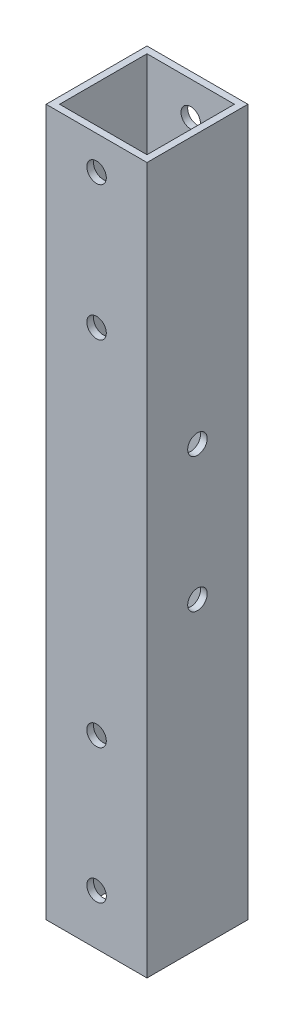
ISO-10303-21;
HEADER;
FILE_DESCRIPTION(('STEP AP214'),'2;1');
FILE_NAME('part.step','',(''),(''),'','','');
FILE_SCHEMA(('AUTOMOTIVE_DESIGN { 1 0 10303 214 1 1 1 1 }'));
ENDSEC;
DATA;
#1=APPLICATION_CONTEXT('core data for automotive mechanical design processes');
#2=APPLICATION_PROTOCOL_DEFINITION('international standard','automotive_design',2000,#1);
#3=PRODUCT_CONTEXT('',#1,'mechanical');
#4=PRODUCT('Part','Part','',(#3));
#5=PRODUCT_RELATED_PRODUCT_CATEGORY('part','',(#4));
#6=PRODUCT_DEFINITION_FORMATION('','',#4);
#7=PRODUCT_DEFINITION_CONTEXT('part definition',#1,'design');
#8=PRODUCT_DEFINITION('design','',#6,#7);
#9=PRODUCT_DEFINITION_SHAPE('','',#8);
#10=(LENGTH_UNIT() NAMED_UNIT(*) SI_UNIT(.MILLI.,.METRE.));
#11=(NAMED_UNIT(*) PLANE_ANGLE_UNIT() SI_UNIT($,.RADIAN.));
#12=(NAMED_UNIT(*) SI_UNIT($,.STERADIAN.) SOLID_ANGLE_UNIT());
#13=UNCERTAINTY_MEASURE_WITH_UNIT(LENGTH_MEASURE(1.E-05),#10,'distance_accuracy_value','');
#14=(GEOMETRIC_REPRESENTATION_CONTEXT(3) GLOBAL_UNCERTAINTY_ASSIGNED_CONTEXT((#13)) GLOBAL_UNIT_ASSIGNED_CONTEXT((#10,
#11,#12)) REPRESENTATION_CONTEXT('',''));
#15=CARTESIAN_POINT('',(0.,0.,0.));
#16=DIRECTION('',(0.,0.,1.));
#17=DIRECTION('',(1.,0.,0.));
#18=AXIS2_PLACEMENT_3D('',#15,#16,#17);
#19=CARTESIAN_POINT('',(0.,105.,0.));
#20=DIRECTION('',(0.,1.,0.));
#21=DIRECTION('',(0.,0.,1.));
#22=AXIS2_PLACEMENT_3D('',#19,#20,#21);
#23=PLANE('',#22);
#24=DIRECTION('',(0.,0.,-1.));
#25=VECTOR('',#24,1.);
#26=CARTESIAN_POINT('',(7.5,105.,7.5));
#27=LINE('',#26,#25);
#28=CARTESIAN_POINT('',(7.5,105.,7.5));
#29=VERTEX_POINT('',#28);
#30=CARTESIAN_POINT('',(7.5,105.,-7.5));
#31=VERTEX_POINT('',#30);
#32=EDGE_CURVE('E187',#29,#31,#27,.T.);
#33=ORIENTED_EDGE('',*,*,#32,.T.);
#34=DIRECTION('',(-1.,0.,0.));
#35=VECTOR('',#34,1.);
#36=CARTESIAN_POINT('',(-7.5,105.,-7.5));
#37=LINE('',#36,#35);
#38=CARTESIAN_POINT('',(-7.5,105.,-7.5));
#39=VERTEX_POINT('',#38);
#40=EDGE_CURVE('E191',#31,#39,#37,.T.);
#41=ORIENTED_EDGE('',*,*,#40,.T.);
#42=DIRECTION('',(0.,0.,1.));
#43=VECTOR('',#42,1.);
#44=CARTESIAN_POINT('',(-7.5,105.,7.5));
#45=LINE('',#44,#43);
#46=CARTESIAN_POINT('',(-7.5,105.,7.5));
#47=VERTEX_POINT('',#46);
#48=EDGE_CURVE('E195',#39,#47,#45,.T.);
#49=ORIENTED_EDGE('',*,*,#48,.T.);
#50=DIRECTION('',(1.,0.,0.));
#51=VECTOR('',#50,1.);
#52=CARTESIAN_POINT('',(-7.5,105.,7.5));
#53=LINE('',#52,#51);
#54=EDGE_CURVE('E198',#47,#29,#53,.T.);
#55=ORIENTED_EDGE('',*,*,#54,.T.);
#56=EDGE_LOOP('',(#33,#41,#49,#55));
#57=FACE_BOUND('',#56,.T.);
#58=DIRECTION('',(-1.,0.,0.));
#59=VECTOR('',#58,1.);
#60=CARTESIAN_POINT('',(0.,105.,-6.5));
#61=LINE('',#60,#59);
#62=CARTESIAN_POINT('',(6.5,105.,-6.5));
#63=VERTEX_POINT('',#62);
#64=CARTESIAN_POINT('',(-6.5,105.,-6.5));
#65=VERTEX_POINT('',#64);
#66=EDGE_CURVE('E146',#63,#65,#61,.T.);
#67=ORIENTED_EDGE('',*,*,#66,.F.);
#68=DIRECTION('',(0.,0.,-1.));
#69=VECTOR('',#68,1.);
#70=CARTESIAN_POINT('',(6.5,105.,0.));
#71=LINE('',#70,#69);
#72=CARTESIAN_POINT('',(6.5,105.,6.5));
#73=VERTEX_POINT('',#72);
#74=EDGE_CURVE('E137',#73,#63,#71,.T.);
#75=ORIENTED_EDGE('',*,*,#74,.F.);
#76=DIRECTION('',(1.,0.,0.));
#77=VECTOR('',#76,1.);
#78=CARTESIAN_POINT('',(0.,105.,6.5));
#79=LINE('',#78,#77);
#80=CARTESIAN_POINT('',(-6.5,105.,6.5));
#81=VERTEX_POINT('',#80);
#82=EDGE_CURVE('E163',#81,#73,#79,.T.);
#83=ORIENTED_EDGE('',*,*,#82,.F.);
#84=DIRECTION('',(0.,0.,1.));
#85=VECTOR('',#84,1.);
#86=CARTESIAN_POINT('',(-6.5,105.,0.));
#87=LINE('',#86,#85);
#88=EDGE_CURVE('E159',#65,#81,#87,.T.);
#89=ORIENTED_EDGE('',*,*,#88,.F.);
#90=EDGE_LOOP('',(#67,#75,#83,#89));
#91=FACE_BOUND('',#90,.T.);
#92=ADVANCED_FACE('F69',(#57,#91),#23,.T.);
#93=CARTESIAN_POINT('',(0.,0.,0.));
#94=DIRECTION('',(0.,1.,0.));
#95=DIRECTION('',(0.,0.,1.));
#96=AXIS2_PLACEMENT_3D('',#93,#94,#95);
#97=PLANE('',#96);
#98=DIRECTION('',(0.,0.,-1.));
#99=VECTOR('',#98,1.);
#100=CARTESIAN_POINT('',(7.5,0.,7.5));
#101=LINE('',#100,#99);
#102=CARTESIAN_POINT('',(7.5,0.,7.5));
#103=VERTEX_POINT('',#102);
#104=CARTESIAN_POINT('',(7.5,0.,-7.5));
#105=VERTEX_POINT('',#104);
#106=EDGE_CURVE('E155',#103,#105,#101,.T.);
#107=ORIENTED_EDGE('',*,*,#106,.F.);
#108=DIRECTION('',(1.,0.,0.));
#109=VECTOR('',#108,1.);
#110=CARTESIAN_POINT('',(-7.5,0.,7.5));
#111=LINE('',#110,#109);
#112=CARTESIAN_POINT('',(-7.5,0.,7.5));
#113=VERTEX_POINT('',#112);
#114=EDGE_CURVE('E192',#113,#103,#111,.T.);
#115=ORIENTED_EDGE('',*,*,#114,.F.);
#116=DIRECTION('',(0.,0.,1.));
#117=VECTOR('',#116,1.);
#118=CARTESIAN_POINT('',(-7.5,0.,7.5));
#119=LINE('',#118,#117);
#120=CARTESIAN_POINT('',(-7.5,0.,-7.5));
#121=VERTEX_POINT('',#120);
#122=EDGE_CURVE('E208',#121,#113,#119,.T.);
#123=ORIENTED_EDGE('',*,*,#122,.F.);
#124=DIRECTION('',(-1.,0.,0.));
#125=VECTOR('',#124,1.);
#126=CARTESIAN_POINT('',(-7.5,0.,-7.5));
#127=LINE('',#126,#125);
#128=EDGE_CURVE('E205',#105,#121,#127,.T.);
#129=ORIENTED_EDGE('',*,*,#128,.F.);
#130=EDGE_LOOP('',(#107,#115,#123,#129));
#131=FACE_BOUND('',#130,.T.);
#132=DIRECTION('',(0.,0.,-1.));
#133=VECTOR('',#132,1.);
#134=CARTESIAN_POINT('',(6.5,0.,0.));
#135=LINE('',#134,#133);
#136=CARTESIAN_POINT('',(6.5,0.,6.5));
#137=VERTEX_POINT('',#136);
#138=CARTESIAN_POINT('',(6.5,0.,-6.5));
#139=VERTEX_POINT('',#138);
#140=EDGE_CURVE('E95',#137,#139,#135,.T.);
#141=ORIENTED_EDGE('',*,*,#140,.T.);
#142=DIRECTION('',(-1.,0.,0.));
#143=VECTOR('',#142,1.);
#144=CARTESIAN_POINT('',(0.,0.,-6.5));
#145=LINE('',#144,#143);
#146=CARTESIAN_POINT('',(-6.5,0.,-6.5));
#147=VERTEX_POINT('',#146);
#148=EDGE_CURVE('E153',#139,#147,#145,.T.);
#149=ORIENTED_EDGE('',*,*,#148,.T.);
#150=DIRECTION('',(0.,0.,1.));
#151=VECTOR('',#150,1.);
#152=CARTESIAN_POINT('',(-6.5,0.,0.));
#153=LINE('',#152,#151);
#154=CARTESIAN_POINT('',(-6.5,0.,6.5));
#155=VERTEX_POINT('',#154);
#156=EDGE_CURVE('E174',#147,#155,#153,.T.);
#157=ORIENTED_EDGE('',*,*,#156,.T.);
#158=DIRECTION('',(1.,0.,0.));
#159=VECTOR('',#158,1.);
#160=CARTESIAN_POINT('',(0.,0.,6.5));
#161=LINE('',#160,#159);
#162=EDGE_CURVE('E147',#155,#137,#161,.T.);
#163=ORIENTED_EDGE('',*,*,#162,.T.);
#164=EDGE_LOOP('',(#141,#149,#157,#163));
#165=FACE_BOUND('',#164,.T.);
#166=ADVANCED_FACE('F353',(#131,#165),#97,.F.);
#167=CARTESIAN_POINT('',(7.5,105.,7.5));
#168=DIRECTION('',(-1.,0.,0.));
#169=DIRECTION('',(0.,0.,1.));
#170=AXIS2_PLACEMENT_3D('',#167,#168,#169);
#171=PLANE('',#170);
#172=CARTESIAN_POINT('',(7.5,65.,0.));
#173=DIRECTION('',(1.,0.,0.));
#174=DIRECTION('',(0.,0.,-1.));
#175=AXIS2_PLACEMENT_3D('',#172,#173,#174);
#176=CIRCLE('',#175,1.45);
#177=CARTESIAN_POINT('',(7.5,65.,-1.45));
#178=VERTEX_POINT('',#177);
#179=EDGE_CURVE('E254',#178,#178,#176,.T.);
#180=ORIENTED_EDGE('',*,*,#179,.F.);
#181=EDGE_LOOP('',(#180));
#182=FACE_BOUND('',#181,.T.);
#183=CARTESIAN_POINT('',(7.5,45.,0.));
#184=DIRECTION('',(1.,0.,0.));
#185=DIRECTION('',(0.,0.,-1.));
#186=AXIS2_PLACEMENT_3D('',#183,#184,#185);
#187=CIRCLE('',#186,1.45);
#188=CARTESIAN_POINT('',(7.5,45.,-1.45));
#189=VERTEX_POINT('',#188);
#190=EDGE_CURVE('E260',#189,#189,#187,.T.);
#191=ORIENTED_EDGE('',*,*,#190,.F.);
#192=EDGE_LOOP('',(#191));
#193=FACE_BOUND('',#192,.T.);
#194=ORIENTED_EDGE('',*,*,#106,.T.);
#195=DIRECTION('',(0.,-1.,0.));
#196=VECTOR('',#195,1.);
#197=CARTESIAN_POINT('',(7.5,105.,-7.5));
#198=LINE('',#197,#196);
#199=EDGE_CURVE('E12',#31,#105,#198,.T.);
#200=ORIENTED_EDGE('',*,*,#199,.F.);
#201=ORIENTED_EDGE('',*,*,#32,.F.);
#202=DIRECTION('',(0.,-1.,0.));
#203=VECTOR('',#202,1.);
#204=CARTESIAN_POINT('',(7.5,105.,7.5));
#205=LINE('',#204,#203);
#206=EDGE_CURVE('E201',#29,#103,#205,.T.);
#207=ORIENTED_EDGE('',*,*,#206,.T.);
#208=EDGE_LOOP('',(#194,#200,#201,#207));
#209=FACE_BOUND('',#208,.T.);
#210=ADVANCED_FACE('F71',(#182,#193,#209),#171,.F.);
#211=CARTESIAN_POINT('',(-7.5,105.,-7.5));
#212=DIRECTION('',(0.,0.,1.));
#213=DIRECTION('',(1.,0.,0.));
#214=AXIS2_PLACEMENT_3D('',#211,#212,#213);
#215=PLANE('',#214);
#216=CARTESIAN_POINT('',(0.,7.5,-7.5));
#217=DIRECTION('',(0.,0.,1.));
#218=DIRECTION('',(1.,0.,0.));
#219=AXIS2_PLACEMENT_3D('',#216,#217,#218);
#220=CIRCLE('',#219,1.45);
#221=CARTESIAN_POINT('',(1.45,7.5,-7.5));
#222=VERTEX_POINT('',#221);
#223=EDGE_CURVE('E228',#222,#222,#220,.T.);
#224=ORIENTED_EDGE('',*,*,#223,.T.);
#225=EDGE_LOOP('',(#224));
#226=FACE_BOUND('',#225,.T.);
#227=CARTESIAN_POINT('',(0.,80.,-7.5));
#228=DIRECTION('',(0.,0.,1.));
#229=DIRECTION('',(1.,0.,0.));
#230=AXIS2_PLACEMENT_3D('',#227,#228,#229);
#231=CIRCLE('',#230,1.45);
#232=CARTESIAN_POINT('',(1.45,80.,-7.5));
#233=VERTEX_POINT('',#232);
#234=EDGE_CURVE('E274',#233,#233,#231,.T.);
#235=ORIENTED_EDGE('',*,*,#234,.T.);
#236=EDGE_LOOP('',(#235));
#237=FACE_BOUND('',#236,.T.);
#238=CARTESIAN_POINT('',(0.,100.,-7.5));
#239=DIRECTION('',(0.,0.,1.));
#240=DIRECTION('',(1.,0.,0.));
#241=AXIS2_PLACEMENT_3D('',#238,#239,#240);
#242=CIRCLE('',#241,1.45);
#243=CARTESIAN_POINT('',(1.45,100.,-7.5));
#244=VERTEX_POINT('',#243);
#245=EDGE_CURVE('E287',#244,#244,#242,.T.);
#246=ORIENTED_EDGE('',*,*,#245,.T.);
#247=EDGE_LOOP('',(#246));
#248=FACE_BOUND('',#247,.T.);
#249=CARTESIAN_POINT('',(0.,27.5,-7.5));
#250=DIRECTION('',(0.,0.,1.));
#251=DIRECTION('',(1.,0.,0.));
#252=AXIS2_PLACEMENT_3D('',#249,#250,#251);
#253=CIRCLE('',#252,1.45);
#254=CARTESIAN_POINT('',(1.45,27.5,-7.5));
#255=VERTEX_POINT('',#254);
#256=EDGE_CURVE('E294',#255,#255,#253,.T.);
#257=ORIENTED_EDGE('',*,*,#256,.T.);
#258=EDGE_LOOP('',(#257));
#259=FACE_BOUND('',#258,.T.);
#260=ORIENTED_EDGE('',*,*,#128,.T.);
#261=DIRECTION('',(0.,-1.,0.));
#262=VECTOR('',#261,1.);
#263=CARTESIAN_POINT('',(-7.5,105.,-7.5));
#264=LINE('',#263,#262);
#265=EDGE_CURVE('E79',#39,#121,#264,.T.);
#266=ORIENTED_EDGE('',*,*,#265,.F.);
#267=ORIENTED_EDGE('',*,*,#40,.F.);
#268=ORIENTED_EDGE('',*,*,#199,.T.);
#269=EDGE_LOOP('',(#260,#266,#267,#268));
#270=FACE_BOUND('',#269,.T.);
#271=ADVANCED_FACE('F339',(#226,#237,#248,#259,#270),#215,.F.);
#272=CARTESIAN_POINT('',(-7.5,105.,7.5));
#273=DIRECTION('',(1.,0.,0.));
#274=DIRECTION('',(0.,0.,-1.));
#275=AXIS2_PLACEMENT_3D('',#272,#273,#274);
#276=PLANE('',#275);
#277=CARTESIAN_POINT('',(-7.5,65.,0.));
#278=DIRECTION('',(1.,0.,0.));
#279=DIRECTION('',(0.,0.,-1.));
#280=AXIS2_PLACEMENT_3D('',#277,#278,#279);
#281=CIRCLE('',#280,1.45);
#282=CARTESIAN_POINT('',(-7.5,65.,-1.45));
#283=VERTEX_POINT('',#282);
#284=EDGE_CURVE('E246',#283,#283,#281,.T.);
#285=ORIENTED_EDGE('',*,*,#284,.T.);
#286=EDGE_LOOP('',(#285));
#287=FACE_BOUND('',#286,.T.);
#288=CARTESIAN_POINT('',(-7.5,45.,0.));
#289=DIRECTION('',(1.,0.,0.));
#290=DIRECTION('',(0.,0.,-1.));
#291=AXIS2_PLACEMENT_3D('',#288,#289,#290);
#292=CIRCLE('',#291,1.45);
#293=CARTESIAN_POINT('',(-7.5,45.,-1.45));
#294=VERTEX_POINT('',#293);
#295=EDGE_CURVE('E266',#294,#294,#292,.T.);
#296=ORIENTED_EDGE('',*,*,#295,.T.);
#297=EDGE_LOOP('',(#296));
#298=FACE_BOUND('',#297,.T.);
#299=ORIENTED_EDGE('',*,*,#122,.T.);
#300=DIRECTION('',(0.,-1.,0.));
#301=VECTOR('',#300,1.);
#302=CARTESIAN_POINT('',(-7.5,105.,7.5));
#303=LINE('',#302,#301);
#304=EDGE_CURVE('E216',#47,#113,#303,.T.);
#305=ORIENTED_EDGE('',*,*,#304,.F.);
#306=ORIENTED_EDGE('',*,*,#48,.F.);
#307=ORIENTED_EDGE('',*,*,#265,.T.);
#308=EDGE_LOOP('',(#299,#305,#306,#307));
#309=FACE_BOUND('',#308,.T.);
#310=ADVANCED_FACE('F342',(#287,#298,#309),#276,.F.);
#311=CARTESIAN_POINT('',(-7.5,105.,7.5));
#312=DIRECTION('',(0.,0.,-1.));
#313=DIRECTION('',(-1.,0.,0.));
#314=AXIS2_PLACEMENT_3D('',#311,#312,#313);
#315=PLANE('',#314);
#316=CARTESIAN_POINT('',(0.,7.5,7.5));
#317=DIRECTION('',(0.,0.,1.));
#318=DIRECTION('',(1.,0.,0.));
#319=AXIS2_PLACEMENT_3D('',#316,#317,#318);
#320=CIRCLE('',#319,1.45);
#321=CARTESIAN_POINT('',(1.45,7.5,7.5));
#322=VERTEX_POINT('',#321);
#323=EDGE_CURVE('E278',#322,#322,#320,.T.);
#324=ORIENTED_EDGE('',*,*,#323,.F.);
#325=EDGE_LOOP('',(#324));
#326=FACE_BOUND('',#325,.T.);
#327=CARTESIAN_POINT('',(0.,80.,7.5));
#328=DIRECTION('',(0.,0.,1.));
#329=DIRECTION('',(1.,0.,0.));
#330=AXIS2_PLACEMENT_3D('',#327,#328,#329);
#331=CIRCLE('',#330,1.45);
#332=CARTESIAN_POINT('',(1.45,80.,7.5));
#333=VERTEX_POINT('',#332);
#334=EDGE_CURVE('E283',#333,#333,#331,.T.);
#335=ORIENTED_EDGE('',*,*,#334,.F.);
#336=EDGE_LOOP('',(#335));
#337=FACE_BOUND('',#336,.T.);
#338=CARTESIAN_POINT('',(0.,100.,7.5));
#339=DIRECTION('',(0.,0.,1.));
#340=DIRECTION('',(1.,0.,0.));
#341=AXIS2_PLACEMENT_3D('',#338,#339,#340);
#342=CIRCLE('',#341,1.45);
#343=CARTESIAN_POINT('',(1.45,100.,7.5));
#344=VERTEX_POINT('',#343);
#345=EDGE_CURVE('E298',#344,#344,#342,.T.);
#346=ORIENTED_EDGE('',*,*,#345,.F.);
#347=EDGE_LOOP('',(#346));
#348=FACE_BOUND('',#347,.T.);
#349=CARTESIAN_POINT('',(0.,27.5,7.5));
#350=DIRECTION('',(0.,0.,1.));
#351=DIRECTION('',(1.,0.,0.));
#352=AXIS2_PLACEMENT_3D('',#349,#350,#351);
#353=CIRCLE('',#352,1.45);
#354=CARTESIAN_POINT('',(1.45,27.5,7.5));
#355=VERTEX_POINT('',#354);
#356=EDGE_CURVE('E282',#355,#355,#353,.T.);
#357=ORIENTED_EDGE('',*,*,#356,.F.);
#358=EDGE_LOOP('',(#357));
#359=FACE_BOUND('',#358,.T.);
#360=ORIENTED_EDGE('',*,*,#114,.T.);
#361=ORIENTED_EDGE('',*,*,#206,.F.);
#362=ORIENTED_EDGE('',*,*,#54,.F.);
#363=ORIENTED_EDGE('',*,*,#304,.T.);
#364=EDGE_LOOP('',(#360,#361,#362,#363));
#365=FACE_BOUND('',#364,.T.);
#366=ADVANCED_FACE('F357',(#326,#337,#348,#359,#365),#315,.F.);
#367=CARTESIAN_POINT('',(6.5,105.,0.));
#368=DIRECTION('',(-1.,0.,0.));
#369=DIRECTION('',(0.,0.,1.));
#370=AXIS2_PLACEMENT_3D('',#367,#368,#369);
#371=PLANE('',#370);
#372=CARTESIAN_POINT('',(6.5,65.,0.));
#373=DIRECTION('',(-1.,0.,0.));
#374=DIRECTION('',(0.,0.,1.));
#375=AXIS2_PLACEMENT_3D('',#372,#373,#374);
#376=CIRCLE('',#375,1.45);
#377=CARTESIAN_POINT('',(6.5,65.,1.45));
#378=VERTEX_POINT('',#377);
#379=EDGE_CURVE('E270',#378,#378,#376,.T.);
#380=ORIENTED_EDGE('',*,*,#379,.F.);
#381=EDGE_LOOP('',(#380));
#382=FACE_BOUND('',#381,.T.);
#383=CARTESIAN_POINT('',(6.5,45.,0.));
#384=DIRECTION('',(-1.,0.,0.));
#385=DIRECTION('',(0.,0.,1.));
#386=AXIS2_PLACEMENT_3D('',#383,#384,#385);
#387=CIRCLE('',#386,1.45);
#388=CARTESIAN_POINT('',(6.5,45.,1.45));
#389=VERTEX_POINT('',#388);
#390=EDGE_CURVE('E245',#389,#389,#387,.T.);
#391=ORIENTED_EDGE('',*,*,#390,.F.);
#392=EDGE_LOOP('',(#391));
#393=FACE_BOUND('',#392,.T.);
#394=ORIENTED_EDGE('',*,*,#140,.F.);
#395=DIRECTION('',(0.,-1.,0.));
#396=VECTOR('',#395,1.);
#397=CARTESIAN_POINT('',(6.5,105.,6.5));
#398=LINE('',#397,#396);
#399=EDGE_CURVE('E141',#73,#137,#398,.T.);
#400=ORIENTED_EDGE('',*,*,#399,.F.);
#401=ORIENTED_EDGE('',*,*,#74,.T.);
#402=DIRECTION('',(0.,-1.,0.));
#403=VECTOR('',#402,1.);
#404=CARTESIAN_POINT('',(6.5,105.,-6.5));
#405=LINE('',#404,#403);
#406=EDGE_CURVE('E140',#63,#139,#405,.T.);
#407=ORIENTED_EDGE('',*,*,#406,.T.);
#408=EDGE_LOOP('',(#394,#400,#401,#407));
#409=FACE_BOUND('',#408,.T.);
#410=ADVANCED_FACE('F139',(#382,#393,#409),#371,.T.);
#411=CARTESIAN_POINT('',(0.,105.,-6.5));
#412=DIRECTION('',(0.,0.,1.));
#413=DIRECTION('',(1.,0.,0.));
#414=AXIS2_PLACEMENT_3D('',#411,#412,#413);
#415=PLANE('',#414);
#416=CARTESIAN_POINT('',(0.,7.5,-6.5));
#417=DIRECTION('',(0.,0.,1.));
#418=DIRECTION('',(1.,0.,0.));
#419=AXIS2_PLACEMENT_3D('',#416,#417,#418);
#420=CIRCLE('',#419,1.45);
#421=CARTESIAN_POINT('',(1.45,7.5,-6.5));
#422=VERTEX_POINT('',#421);
#423=EDGE_CURVE('E171',#422,#422,#420,.T.);
#424=ORIENTED_EDGE('',*,*,#423,.F.);
#425=EDGE_LOOP('',(#424));
#426=FACE_BOUND('',#425,.T.);
#427=CARTESIAN_POINT('',(0.,80.,-6.5));
#428=DIRECTION('',(0.,0.,1.));
#429=DIRECTION('',(1.,0.,0.));
#430=AXIS2_PLACEMENT_3D('',#427,#428,#429);
#431=CIRCLE('',#430,1.45);
#432=CARTESIAN_POINT('',(1.45,80.,-6.5));
#433=VERTEX_POINT('',#432);
#434=EDGE_CURVE('E238',#433,#433,#431,.T.);
#435=ORIENTED_EDGE('',*,*,#434,.F.);
#436=EDGE_LOOP('',(#435));
#437=FACE_BOUND('',#436,.T.);
#438=CARTESIAN_POINT('',(0.,100.,-6.5));
#439=DIRECTION('',(0.,0.,1.));
#440=DIRECTION('',(1.,0.,0.));
#441=AXIS2_PLACEMENT_3D('',#438,#439,#440);
#442=CIRCLE('',#441,1.45);
#443=CARTESIAN_POINT('',(1.45,100.,-6.5));
#444=VERTEX_POINT('',#443);
#445=EDGE_CURVE('E233',#444,#444,#442,.T.);
#446=ORIENTED_EDGE('',*,*,#445,.F.);
#447=EDGE_LOOP('',(#446));
#448=FACE_BOUND('',#447,.T.);
#449=CARTESIAN_POINT('',(0.,27.5,-6.5));
#450=DIRECTION('',(0.,0.,1.));
#451=DIRECTION('',(1.,0.,0.));
#452=AXIS2_PLACEMENT_3D('',#449,#450,#451);
#453=CIRCLE('',#452,1.45);
#454=CARTESIAN_POINT('',(1.45,27.5,-6.5));
#455=VERTEX_POINT('',#454);
#456=EDGE_CURVE('E227',#455,#455,#453,.T.);
#457=ORIENTED_EDGE('',*,*,#456,.F.);
#458=EDGE_LOOP('',(#457));
#459=FACE_BOUND('',#458,.T.);
#460=ORIENTED_EDGE('',*,*,#148,.F.);
#461=ORIENTED_EDGE('',*,*,#406,.F.);
#462=ORIENTED_EDGE('',*,*,#66,.T.);
#463=DIRECTION('',(0.,-1.,0.));
#464=VECTOR('',#463,1.);
#465=CARTESIAN_POINT('',(-6.5,105.,-6.5));
#466=LINE('',#465,#464);
#467=EDGE_CURVE('E156',#65,#147,#466,.T.);
#468=ORIENTED_EDGE('',*,*,#467,.T.);
#469=EDGE_LOOP('',(#460,#461,#462,#468));
#470=FACE_BOUND('',#469,.T.);
#471=ADVANCED_FACE('F150',(#426,#437,#448,#459,#470),#415,.T.);
#472=CARTESIAN_POINT('',(-6.5,105.,0.));
#473=DIRECTION('',(1.,0.,0.));
#474=DIRECTION('',(0.,0.,-1.));
#475=AXIS2_PLACEMENT_3D('',#472,#473,#474);
#476=PLANE('',#475);
#477=CARTESIAN_POINT('',(-6.5,65.,0.));
#478=DIRECTION('',(1.,0.,0.));
#479=DIRECTION('',(0.,0.,-1.));
#480=AXIS2_PLACEMENT_3D('',#477,#478,#479);
#481=CIRCLE('',#480,1.45);
#482=CARTESIAN_POINT('',(-6.5,65.,-1.45));
#483=VERTEX_POINT('',#482);
#484=EDGE_CURVE('E73',#483,#483,#481,.T.);
#485=ORIENTED_EDGE('',*,*,#484,.F.);
#486=EDGE_LOOP('',(#485));
#487=FACE_BOUND('',#486,.T.);
#488=CARTESIAN_POINT('',(-6.5,45.,0.));
#489=DIRECTION('',(1.,0.,0.));
#490=DIRECTION('',(0.,0.,-1.));
#491=AXIS2_PLACEMENT_3D('',#488,#489,#490);
#492=CIRCLE('',#491,1.45);
#493=CARTESIAN_POINT('',(-6.5,45.,-1.45));
#494=VERTEX_POINT('',#493);
#495=EDGE_CURVE('E242',#494,#494,#492,.T.);
#496=ORIENTED_EDGE('',*,*,#495,.F.);
#497=EDGE_LOOP('',(#496));
#498=FACE_BOUND('',#497,.T.);
#499=ORIENTED_EDGE('',*,*,#156,.F.);
#500=ORIENTED_EDGE('',*,*,#467,.F.);
#501=ORIENTED_EDGE('',*,*,#88,.T.);
#502=DIRECTION('',(0.,-1.,0.));
#503=VECTOR('',#502,1.);
#504=CARTESIAN_POINT('',(-6.5,105.,6.5));
#505=LINE('',#504,#503);
#506=EDGE_CURVE('E87',#81,#155,#505,.T.);
#507=ORIENTED_EDGE('',*,*,#506,.T.);
#508=EDGE_LOOP('',(#499,#500,#501,#507));
#509=FACE_BOUND('',#508,.T.);
#510=ADVANCED_FACE('F322',(#487,#498,#509),#476,.T.);
#511=CARTESIAN_POINT('',(0.,105.,6.5));
#512=DIRECTION('',(0.,0.,-1.));
#513=DIRECTION('',(-1.,0.,0.));
#514=AXIS2_PLACEMENT_3D('',#511,#512,#513);
#515=PLANE('',#514);
#516=CARTESIAN_POINT('',(0.,7.5,6.5));
#517=DIRECTION('',(0.,0.,-1.));
#518=DIRECTION('',(-1.,0.,0.));
#519=AXIS2_PLACEMENT_3D('',#516,#517,#518);
#520=CIRCLE('',#519,1.45);
#521=CARTESIAN_POINT('',(-1.45,7.5,6.5));
#522=VERTEX_POINT('',#521);
#523=EDGE_CURVE('E239',#522,#522,#520,.T.);
#524=ORIENTED_EDGE('',*,*,#523,.F.);
#525=EDGE_LOOP('',(#524));
#526=FACE_BOUND('',#525,.T.);
#527=CARTESIAN_POINT('',(0.,80.,6.5));
#528=DIRECTION('',(0.,0.,-1.));
#529=DIRECTION('',(-1.,0.,0.));
#530=AXIS2_PLACEMENT_3D('',#527,#528,#529);
#531=CIRCLE('',#530,1.45);
#532=CARTESIAN_POINT('',(-1.45,80.,6.5));
#533=VERTEX_POINT('',#532);
#534=EDGE_CURVE('E234',#533,#533,#531,.T.);
#535=ORIENTED_EDGE('',*,*,#534,.F.);
#536=EDGE_LOOP('',(#535));
#537=FACE_BOUND('',#536,.T.);
#538=CARTESIAN_POINT('',(0.,100.,6.5));
#539=DIRECTION('',(0.,0.,-1.));
#540=DIRECTION('',(-1.,0.,0.));
#541=AXIS2_PLACEMENT_3D('',#538,#539,#540);
#542=CIRCLE('',#541,1.45);
#543=CARTESIAN_POINT('',(-1.45,100.,6.5));
#544=VERTEX_POINT('',#543);
#545=EDGE_CURVE('E229',#544,#544,#542,.T.);
#546=ORIENTED_EDGE('',*,*,#545,.F.);
#547=EDGE_LOOP('',(#546));
#548=FACE_BOUND('',#547,.T.);
#549=CARTESIAN_POINT('',(0.,27.5,6.5));
#550=DIRECTION('',(0.,0.,-1.));
#551=DIRECTION('',(-1.,0.,0.));
#552=AXIS2_PLACEMENT_3D('',#549,#550,#551);
#553=CIRCLE('',#552,1.45);
#554=CARTESIAN_POINT('',(-1.45,27.5,6.5));
#555=VERTEX_POINT('',#554);
#556=EDGE_CURVE('E223',#555,#555,#553,.T.);
#557=ORIENTED_EDGE('',*,*,#556,.F.);
#558=EDGE_LOOP('',(#557));
#559=FACE_BOUND('',#558,.T.);
#560=ORIENTED_EDGE('',*,*,#162,.F.);
#561=ORIENTED_EDGE('',*,*,#506,.F.);
#562=ORIENTED_EDGE('',*,*,#82,.T.);
#563=ORIENTED_EDGE('',*,*,#399,.T.);
#564=EDGE_LOOP('',(#560,#561,#562,#563));
#565=FACE_BOUND('',#564,.T.);
#566=ADVANCED_FACE('F469',(#526,#537,#548,#559,#565),#515,.T.);
#567=CARTESIAN_POINT('',(0.,27.5,-7.5));
#568=DIRECTION('',(0.,0.,1.));
#569=DIRECTION('',(1.,0.,0.));
#570=AXIS2_PLACEMENT_3D('',#567,#568,#569);
#571=CYLINDRICAL_SURFACE('',#570,1.45);
#572=ORIENTED_EDGE('',*,*,#556,.T.);
#573=EDGE_LOOP('',(#572));
#574=FACE_BOUND('',#573,.T.);
#575=ORIENTED_EDGE('',*,*,#356,.T.);
#576=EDGE_LOOP('',(#575));
#577=FACE_BOUND('',#576,.T.);
#578=ADVANCED_FACE('F336',(#574,#577),#571,.F.);
#579=CARTESIAN_POINT('',(0.,100.,-7.5));
#580=DIRECTION('',(0.,0.,1.));
#581=DIRECTION('',(1.,0.,0.));
#582=AXIS2_PLACEMENT_3D('',#579,#580,#581);
#583=CYLINDRICAL_SURFACE('',#582,1.45);
#584=ORIENTED_EDGE('',*,*,#545,.T.);
#585=EDGE_LOOP('',(#584));
#586=FACE_BOUND('',#585,.T.);
#587=ORIENTED_EDGE('',*,*,#345,.T.);
#588=EDGE_LOOP('',(#587));
#589=FACE_BOUND('',#588,.T.);
#590=ADVANCED_FACE('F435',(#586,#589),#583,.F.);
#591=CARTESIAN_POINT('',(0.,80.,-7.5));
#592=DIRECTION('',(0.,0.,1.));
#593=DIRECTION('',(1.,0.,0.));
#594=AXIS2_PLACEMENT_3D('',#591,#592,#593);
#595=CYLINDRICAL_SURFACE('',#594,1.45);
#596=ORIENTED_EDGE('',*,*,#534,.T.);
#597=EDGE_LOOP('',(#596));
#598=FACE_BOUND('',#597,.T.);
#599=ORIENTED_EDGE('',*,*,#334,.T.);
#600=EDGE_LOOP('',(#599));
#601=FACE_BOUND('',#600,.T.);
#602=ADVANCED_FACE('F427',(#598,#601),#595,.F.);
#603=CARTESIAN_POINT('',(0.,7.5,-7.5));
#604=DIRECTION('',(0.,0.,1.));
#605=DIRECTION('',(1.,0.,0.));
#606=AXIS2_PLACEMENT_3D('',#603,#604,#605);
#607=CYLINDRICAL_SURFACE('',#606,1.45);
#608=ORIENTED_EDGE('',*,*,#523,.T.);
#609=EDGE_LOOP('',(#608));
#610=FACE_BOUND('',#609,.T.);
#611=ORIENTED_EDGE('',*,*,#323,.T.);
#612=EDGE_LOOP('',(#611));
#613=FACE_BOUND('',#612,.T.);
#614=ADVANCED_FACE('F334',(#610,#613),#607,.F.);
#615=ORIENTED_EDGE('',*,*,#456,.T.);
#616=EDGE_LOOP('',(#615));
#617=FACE_BOUND('',#616,.T.);
#618=ORIENTED_EDGE('',*,*,#256,.F.);
#619=EDGE_LOOP('',(#618));
#620=FACE_BOUND('',#619,.T.);
#621=ADVANCED_FACE('F330',(#617,#620),#571,.F.);
#622=ORIENTED_EDGE('',*,*,#445,.T.);
#623=EDGE_LOOP('',(#622));
#624=FACE_BOUND('',#623,.T.);
#625=ORIENTED_EDGE('',*,*,#245,.F.);
#626=EDGE_LOOP('',(#625));
#627=FACE_BOUND('',#626,.T.);
#628=ADVANCED_FACE('F333',(#624,#627),#583,.F.);
#629=ORIENTED_EDGE('',*,*,#434,.T.);
#630=EDGE_LOOP('',(#629));
#631=FACE_BOUND('',#630,.T.);
#632=ORIENTED_EDGE('',*,*,#234,.F.);
#633=EDGE_LOOP('',(#632));
#634=FACE_BOUND('',#633,.T.);
#635=ADVANCED_FACE('F394',(#631,#634),#595,.F.);
#636=ORIENTED_EDGE('',*,*,#423,.T.);
#637=EDGE_LOOP('',(#636));
#638=FACE_BOUND('',#637,.T.);
#639=ORIENTED_EDGE('',*,*,#223,.F.);
#640=EDGE_LOOP('',(#639));
#641=FACE_BOUND('',#640,.T.);
#642=ADVANCED_FACE('F317',(#638,#641),#607,.F.);
#643=CARTESIAN_POINT('',(-7.5,45.,0.));
#644=DIRECTION('',(1.,0.,0.));
#645=DIRECTION('',(0.,0.,-1.));
#646=AXIS2_PLACEMENT_3D('',#643,#644,#645);
#647=CYLINDRICAL_SURFACE('',#646,1.45);
#648=ORIENTED_EDGE('',*,*,#495,.T.);
#649=EDGE_LOOP('',(#648));
#650=FACE_BOUND('',#649,.T.);
#651=ORIENTED_EDGE('',*,*,#295,.F.);
#652=EDGE_LOOP('',(#651));
#653=FACE_BOUND('',#652,.T.);
#654=ADVANCED_FACE('F381',(#650,#653),#647,.F.);
#655=CARTESIAN_POINT('',(-7.5,65.,0.));
#656=DIRECTION('',(1.,0.,0.));
#657=DIRECTION('',(0.,0.,-1.));
#658=AXIS2_PLACEMENT_3D('',#655,#656,#657);
#659=CYLINDRICAL_SURFACE('',#658,1.45);
#660=ORIENTED_EDGE('',*,*,#484,.T.);
#661=EDGE_LOOP('',(#660));
#662=FACE_BOUND('',#661,.T.);
#663=ORIENTED_EDGE('',*,*,#284,.F.);
#664=EDGE_LOOP('',(#663));
#665=FACE_BOUND('',#664,.T.);
#666=ADVANCED_FACE('F383',(#662,#665),#659,.F.);
#667=ORIENTED_EDGE('',*,*,#390,.T.);
#668=EDGE_LOOP('',(#667));
#669=FACE_BOUND('',#668,.T.);
#670=ORIENTED_EDGE('',*,*,#190,.T.);
#671=EDGE_LOOP('',(#670));
#672=FACE_BOUND('',#671,.T.);
#673=ADVANCED_FACE('F385',(#669,#672),#647,.F.);
#674=ORIENTED_EDGE('',*,*,#379,.T.);
#675=EDGE_LOOP('',(#674));
#676=FACE_BOUND('',#675,.T.);
#677=ORIENTED_EDGE('',*,*,#179,.T.);
#678=EDGE_LOOP('',(#677));
#679=FACE_BOUND('',#678,.T.);
#680=ADVANCED_FACE('F392',(#676,#679),#659,.F.);
#681=CLOSED_SHELL('',(#92,#166,#210,#271,#310,#366,#410,#471,#510,#566,#578,#590,#602,#614,#621,
#628,#635,#642,#654,#666,#673,#680));
#682=MANIFOLD_SOLID_BREP('B2',#681);
#683=ADVANCED_BREP_SHAPE_REPRESENTATION('',(#18,#682),#14);
#684=SHAPE_DEFINITION_REPRESENTATION(#9,#683);
ENDSEC;
END-ISO-10303-21;
